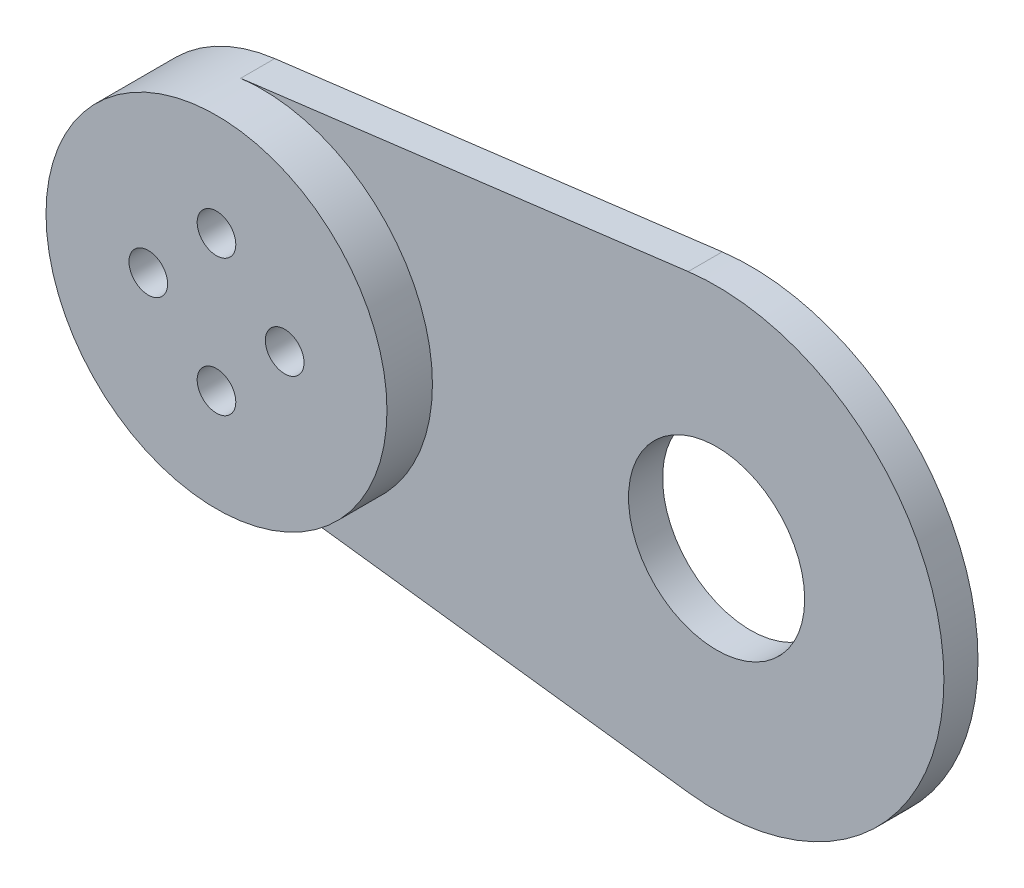
ISO-10303-21;
HEADER;
FILE_DESCRIPTION(('STEP AP214'),'2;1');
FILE_NAME('part.step','',(''),(''),'','','');
FILE_SCHEMA(('AUTOMOTIVE_DESIGN { 1 0 10303 214 1 1 1 1 }'));
ENDSEC;
DATA;
#1=APPLICATION_CONTEXT('core data for automotive mechanical design processes');
#2=APPLICATION_PROTOCOL_DEFINITION('international standard','automotive_design',2000,#1);
#3=PRODUCT_CONTEXT('',#1,'mechanical');
#4=PRODUCT('Part','Part','',(#3));
#5=PRODUCT_RELATED_PRODUCT_CATEGORY('part','',(#4));
#6=PRODUCT_DEFINITION_FORMATION('','',#4);
#7=PRODUCT_DEFINITION_CONTEXT('part definition',#1,'design');
#8=PRODUCT_DEFINITION('design','',#6,#7);
#9=PRODUCT_DEFINITION_SHAPE('','',#8);
#10=(LENGTH_UNIT() NAMED_UNIT(*) SI_UNIT(.MILLI.,.METRE.));
#11=(NAMED_UNIT(*) PLANE_ANGLE_UNIT() SI_UNIT($,.RADIAN.));
#12=(NAMED_UNIT(*) SI_UNIT($,.STERADIAN.) SOLID_ANGLE_UNIT());
#13=UNCERTAINTY_MEASURE_WITH_UNIT(LENGTH_MEASURE(1.E-05),#10,'distance_accuracy_value','');
#14=(GEOMETRIC_REPRESENTATION_CONTEXT(3) GLOBAL_UNCERTAINTY_ASSIGNED_CONTEXT((#13)) GLOBAL_UNIT_ASSIGNED_CONTEXT((#10,
#11,#12)) REPRESENTATION_CONTEXT('',''));
#15=CARTESIAN_POINT('',(0.,0.,0.));
#16=DIRECTION('',(0.,0.,1.));
#17=DIRECTION('',(1.,0.,0.));
#18=AXIS2_PLACEMENT_3D('',#15,#16,#17);
#19=CARTESIAN_POINT('',(-40.3104524024601,20.9571680563574,0.));
#20=DIRECTION('',(0.,0.,1.));
#21=DIRECTION('',(1.,0.,0.));
#22=AXIS2_PLACEMENT_3D('',#19,#20,#21);
#23=CYLINDRICAL_SURFACE('',#22,20.);
#24=CARTESIAN_POINT('',(-40.3104524024601,20.9571680563574,3.));
#25=DIRECTION('',(0.,0.,1.));
#26=DIRECTION('',(1.,0.,0.));
#27=AXIS2_PLACEMENT_3D('',#24,#25,#26);
#28=CIRCLE('',#27,20.);
#29=CARTESIAN_POINT('',(-42.8104524024601,1.11403322337304,3.));
#30=VERTEX_POINT('',#29);
#31=CARTESIAN_POINT('',(-42.8104524024601,40.8003028893419,3.));
#32=VERTEX_POINT('',#31);
#33=EDGE_CURVE('E85',#30,#32,#28,.T.);
#34=ORIENTED_EDGE('',*,*,#33,.F.);
#35=DIRECTION('',(0.,0.,1.));
#36=VECTOR('',#35,1.);
#37=CARTESIAN_POINT('',(-42.8104524024601,1.11403322337304,0.));
#38=LINE('',#37,#36);
#39=CARTESIAN_POINT('',(-42.8104524024601,1.11403322337304,0.));
#40=VERTEX_POINT('',#39);
#41=EDGE_CURVE('E44',#40,#30,#38,.T.);
#42=ORIENTED_EDGE('',*,*,#41,.F.);
#43=CARTESIAN_POINT('',(-40.3104524024601,20.9571680563574,0.));
#44=DIRECTION('',(0.,0.,1.));
#45=DIRECTION('',(1.,0.,0.));
#46=AXIS2_PLACEMENT_3D('',#43,#44,#45);
#47=CIRCLE('',#46,20.);
#48=CARTESIAN_POINT('',(-42.8104524024601,40.8003028893419,0.));
#49=VERTEX_POINT('',#48);
#50=EDGE_CURVE('E101',#40,#49,#47,.T.);
#51=ORIENTED_EDGE('',*,*,#50,.T.);
#52=DIRECTION('',(0.,0.,1.));
#53=VECTOR('',#52,1.);
#54=CARTESIAN_POINT('',(-42.8104524024601,40.8003028893419,0.));
#55=LINE('',#54,#53);
#56=EDGE_CURVE('E38',#49,#32,#55,.T.);
#57=ORIENTED_EDGE('',*,*,#56,.T.);
#58=EDGE_LOOP('',(#34,#42,#51,#57));
#59=FACE_BOUND('',#58,.T.);
#60=ADVANCED_FACE('F35',(#59),#23,.T.);
#61=CARTESIAN_POINT('',(-82.1854524024601,6.07481693161914,0.));
#62=DIRECTION('',(-0.125,-0.992156741649221,0.));
#63=DIRECTION('',(0.992156741649222,-0.125,0.));
#64=AXIS2_PLACEMENT_3D('',#61,#62,#63);
#65=PLANE('',#64);
#66=DIRECTION('',(0.992156741649221,-0.125,0.));
#67=VECTOR('',#66,1.);
#68=CARTESIAN_POINT('',(-82.1854524024601,6.07481693161914,3.));
#69=LINE('',#68,#67);
#70=CARTESIAN_POINT('',(-82.1854524024601,6.07481693161913,3.));
#71=VERTEX_POINT('',#70);
#72=EDGE_CURVE('E86',#71,#30,#69,.T.);
#73=ORIENTED_EDGE('',*,*,#72,.F.);
#74=DIRECTION('',(0.,0.,1.));
#75=VECTOR('',#74,1.);
#76=CARTESIAN_POINT('',(-82.1854524024601,6.07481693161913,0.));
#77=LINE('',#76,#75);
#78=CARTESIAN_POINT('',(-82.1854524024601,6.07481693161913,0.));
#79=VERTEX_POINT('',#78);
#80=EDGE_CURVE('E94',#79,#71,#77,.T.);
#81=ORIENTED_EDGE('',*,*,#80,.F.);
#82=DIRECTION('',(0.992156741649221,-0.125,0.));
#83=VECTOR('',#82,1.);
#84=CARTESIAN_POINT('',(-82.1854524024601,6.07481693161914,0.));
#85=LINE('',#84,#83);
#86=EDGE_CURVE('E108',#79,#40,#85,.T.);
#87=ORIENTED_EDGE('',*,*,#86,.T.);
#88=ORIENTED_EDGE('',*,*,#41,.T.);
#89=EDGE_LOOP('',(#73,#81,#87,#88));
#90=FACE_BOUND('',#89,.T.);
#91=ADVANCED_FACE('F100',(#90),#65,.T.);
#92=CARTESIAN_POINT('',(-80.3104524024601,20.9571680563574,0.));
#93=DIRECTION('',(0.,0.,1.));
#94=DIRECTION('',(1.,0.,0.));
#95=AXIS2_PLACEMENT_3D('',#92,#93,#94);
#96=CYLINDRICAL_SURFACE('',#95,15.);
#97=ORIENTED_EDGE('',*,*,#80,.T.);
#98=CARTESIAN_POINT('',(-80.3104524024601,20.9571680563574,3.));
#99=DIRECTION('',(0.,0.,1.));
#100=DIRECTION('',(1.,0.,0.));
#101=AXIS2_PLACEMENT_3D('',#98,#99,#100);
#102=CIRCLE('',#101,15.);
#103=CARTESIAN_POINT('',(-82.1854524024601,35.8395191810958,3.));
#104=VERTEX_POINT('',#103);
#105=EDGE_CURVE('E11',#71,#104,#102,.T.);
#106=ORIENTED_EDGE('',*,*,#105,.T.);
#107=DIRECTION('',(0.,0.,1.));
#108=VECTOR('',#107,1.);
#109=CARTESIAN_POINT('',(-82.1854524024601,35.8395191810958,0.));
#110=LINE('',#109,#108);
#111=CARTESIAN_POINT('',(-82.1854524024601,35.8395191810958,0.));
#112=VERTEX_POINT('',#111);
#113=EDGE_CURVE('E88',#112,#104,#110,.T.);
#114=ORIENTED_EDGE('',*,*,#113,.F.);
#115=CARTESIAN_POINT('',(-80.3104524024601,20.9571680563574,0.));
#116=DIRECTION('',(0.,0.,1.));
#117=DIRECTION('',(1.,0.,0.));
#118=AXIS2_PLACEMENT_3D('',#115,#116,#117);
#119=CIRCLE('',#118,15.);
#120=EDGE_CURVE('E97',#112,#79,#119,.T.);
#121=ORIENTED_EDGE('',*,*,#120,.T.);
#122=EDGE_LOOP('',(#97,#106,#114,#121));
#123=FACE_BOUND('',#122,.T.);
#124=CARTESIAN_POINT('',(-80.3104524024601,20.9571680563574,7.));
#125=DIRECTION('',(0.,0.,1.));
#126=DIRECTION('',(1.,0.,0.));
#127=AXIS2_PLACEMENT_3D('',#124,#125,#126);
#128=CIRCLE('',#127,15.);
#129=CARTESIAN_POINT('',(-65.3104524024601,20.9571680563574,7.));
#130=VERTEX_POINT('',#129);
#131=EDGE_CURVE('E115',#130,#130,#128,.T.);
#132=ORIENTED_EDGE('',*,*,#131,.F.);
#133=EDGE_LOOP('',(#132));
#134=FACE_BOUND('',#133,.T.);
#135=ADVANCED_FACE('F95',(#123,#134),#96,.T.);
#136=CARTESIAN_POINT('',(-42.8104524024601,40.8003028893419,0.));
#137=DIRECTION('',(-0.124999999999999,0.992156741649222,0.));
#138=DIRECTION('',(-0.992156741649222,-0.124999999999999,0.));
#139=AXIS2_PLACEMENT_3D('',#136,#137,#138);
#140=PLANE('',#139);
#141=DIRECTION('',(-0.992156741649221,-0.124999999999999,0.));
#142=VECTOR('',#141,1.);
#143=CARTESIAN_POINT('',(-42.8104524024601,40.8003028893419,3.));
#144=LINE('',#143,#142);
#145=EDGE_CURVE('E81',#32,#104,#144,.T.);
#146=ORIENTED_EDGE('',*,*,#145,.F.);
#147=ORIENTED_EDGE('',*,*,#56,.F.);
#148=DIRECTION('',(-0.992156741649221,-0.124999999999999,0.));
#149=VECTOR('',#148,1.);
#150=CARTESIAN_POINT('',(-42.8104524024601,40.8003028893419,0.));
#151=LINE('',#150,#149);
#152=EDGE_CURVE('E90',#49,#112,#151,.T.);
#153=ORIENTED_EDGE('',*,*,#152,.T.);
#154=ORIENTED_EDGE('',*,*,#113,.T.);
#155=EDGE_LOOP('',(#146,#147,#153,#154));
#156=FACE_BOUND('',#155,.T.);
#157=ADVANCED_FACE('F89',(#156),#140,.T.);
#158=CARTESIAN_POINT('',(-40.3104524024601,20.9571680563574,0.));
#159=DIRECTION('',(0.,0.,1.));
#160=DIRECTION('',(1.,0.,0.));
#161=AXIS2_PLACEMENT_3D('',#158,#159,#160);
#162=PLANE('',#161);
#163=CARTESIAN_POINT('',(-74.3104524024601,20.9571680563574,0.));
#164=DIRECTION('',(0.,0.,1.));
#165=DIRECTION('',(1.,0.,0.));
#166=AXIS2_PLACEMENT_3D('',#163,#164,#165);
#167=CIRCLE('',#166,1.69999999999999);
#168=CARTESIAN_POINT('',(-72.6104524024601,20.9571680563574,0.));
#169=VERTEX_POINT('',#168);
#170=EDGE_CURVE('E137',#169,#169,#167,.T.);
#171=ORIENTED_EDGE('',*,*,#170,.T.);
#172=EDGE_LOOP('',(#171));
#173=FACE_BOUND('',#172,.T.);
#174=CARTESIAN_POINT('',(-80.3104524024602,14.9571680563574,0.));
#175=DIRECTION('',(0.,0.,1.));
#176=DIRECTION('',(1.,0.,0.));
#177=AXIS2_PLACEMENT_3D('',#174,#175,#176);
#178=CIRCLE('',#177,1.69999999999999);
#179=CARTESIAN_POINT('',(-78.6104524024602,14.9571680563574,0.));
#180=VERTEX_POINT('',#179);
#181=EDGE_CURVE('E130',#180,#180,#178,.T.);
#182=ORIENTED_EDGE('',*,*,#181,.T.);
#183=EDGE_LOOP('',(#182));
#184=FACE_BOUND('',#183,.T.);
#185=CARTESIAN_POINT('',(-86.3104524024601,20.9571680563574,0.));
#186=DIRECTION('',(0.,0.,1.));
#187=DIRECTION('',(1.,0.,0.));
#188=AXIS2_PLACEMENT_3D('',#185,#186,#187);
#189=CIRCLE('',#188,1.7);
#190=CARTESIAN_POINT('',(-84.6104524024601,20.9571680563574,0.));
#191=VERTEX_POINT('',#190);
#192=EDGE_CURVE('E131',#191,#191,#189,.T.);
#193=ORIENTED_EDGE('',*,*,#192,.T.);
#194=EDGE_LOOP('',(#193));
#195=FACE_BOUND('',#194,.T.);
#196=CARTESIAN_POINT('',(-80.3104524024601,26.9571680563575,0.));
#197=DIRECTION('',(0.,0.,1.));
#198=DIRECTION('',(1.,0.,0.));
#199=AXIS2_PLACEMENT_3D('',#196,#197,#198);
#200=CIRCLE('',#199,1.7);
#201=CARTESIAN_POINT('',(-78.6104524024601,26.9571680563575,0.));
#202=VERTEX_POINT('',#201);
#203=EDGE_CURVE('E120',#202,#202,#200,.T.);
#204=ORIENTED_EDGE('',*,*,#203,.T.);
#205=EDGE_LOOP('',(#204));
#206=FACE_BOUND('',#205,.T.);
#207=CARTESIAN_POINT('',(-40.3104524024601,20.9571680563574,0.));
#208=DIRECTION('',(0.,0.,1.));
#209=DIRECTION('',(1.,0.,0.));
#210=AXIS2_PLACEMENT_3D('',#207,#208,#209);
#211=CIRCLE('',#210,7.75);
#212=CARTESIAN_POINT('',(-32.5604524024601,20.9571680563574,0.));
#213=VERTEX_POINT('',#212);
#214=EDGE_CURVE('E107',#213,#213,#211,.T.);
#215=ORIENTED_EDGE('',*,*,#214,.T.);
#216=EDGE_LOOP('',(#215));
#217=FACE_BOUND('',#216,.T.);
#218=ORIENTED_EDGE('',*,*,#50,.F.);
#219=ORIENTED_EDGE('',*,*,#86,.F.);
#220=ORIENTED_EDGE('',*,*,#120,.F.);
#221=ORIENTED_EDGE('',*,*,#152,.F.);
#222=EDGE_LOOP('',(#218,#219,#220,#221));
#223=FACE_BOUND('',#222,.T.);
#224=ADVANCED_FACE('F145',(#173,#184,#195,#206,#217,#223),#162,.F.);
#225=CARTESIAN_POINT('',(-40.3104524024601,20.9571680563574,3.));
#226=DIRECTION('',(0.,0.,1.));
#227=DIRECTION('',(1.,0.,0.));
#228=AXIS2_PLACEMENT_3D('',#225,#226,#227);
#229=PLANE('',#228);
#230=ORIENTED_EDGE('',*,*,#105,.F.);
#231=ORIENTED_EDGE('',*,*,#72,.T.);
#232=ORIENTED_EDGE('',*,*,#33,.T.);
#233=ORIENTED_EDGE('',*,*,#145,.T.);
#234=EDGE_LOOP('',(#230,#231,#232,#233));
#235=FACE_BOUND('',#234,.T.);
#236=CARTESIAN_POINT('',(-40.3104524024601,20.9571680563574,3.));
#237=DIRECTION('',(0.,0.,1.));
#238=DIRECTION('',(1.,0.,0.));
#239=AXIS2_PLACEMENT_3D('',#236,#237,#238);
#240=CIRCLE('',#239,7.75);
#241=CARTESIAN_POINT('',(-32.5604524024601,20.9571680563574,3.));
#242=VERTEX_POINT('',#241);
#243=EDGE_CURVE('E112',#242,#242,#240,.T.);
#244=ORIENTED_EDGE('',*,*,#243,.F.);
#245=EDGE_LOOP('',(#244));
#246=FACE_BOUND('',#245,.T.);
#247=ADVANCED_FACE('F83',(#235,#246),#229,.T.);
#248=CARTESIAN_POINT('',(-40.3104524024601,20.9571680563574,0.));
#249=DIRECTION('',(0.,0.,1.));
#250=DIRECTION('',(1.,0.,0.));
#251=AXIS2_PLACEMENT_3D('',#248,#249,#250);
#252=CYLINDRICAL_SURFACE('',#251,7.75);
#253=ORIENTED_EDGE('',*,*,#214,.F.);
#254=EDGE_LOOP('',(#253));
#255=FACE_BOUND('',#254,.T.);
#256=ORIENTED_EDGE('',*,*,#243,.T.);
#257=EDGE_LOOP('',(#256));
#258=FACE_BOUND('',#257,.T.);
#259=ADVANCED_FACE('F159',(#255,#258),#252,.F.);
#260=CARTESIAN_POINT('',(0.,0.,7.));
#261=DIRECTION('',(0.,0.,1.));
#262=DIRECTION('',(1.,0.,0.));
#263=AXIS2_PLACEMENT_3D('',#260,#261,#262);
#264=PLANE('',#263);
#265=CARTESIAN_POINT('',(-74.3104524024601,20.9571680563574,7.));
#266=DIRECTION('',(0.,0.,1.));
#267=DIRECTION('',(1.,0.,0.));
#268=AXIS2_PLACEMENT_3D('',#265,#266,#267);
#269=CIRCLE('',#268,1.69999999999999);
#270=CARTESIAN_POINT('',(-72.6104524024601,20.9571680563574,7.));
#271=VERTEX_POINT('',#270);
#272=EDGE_CURVE('E126',#271,#271,#269,.T.);
#273=ORIENTED_EDGE('',*,*,#272,.F.);
#274=EDGE_LOOP('',(#273));
#275=FACE_BOUND('',#274,.T.);
#276=CARTESIAN_POINT('',(-80.3104524024602,14.9571680563574,7.));
#277=DIRECTION('',(0.,0.,1.));
#278=DIRECTION('',(1.,0.,0.));
#279=AXIS2_PLACEMENT_3D('',#276,#277,#278);
#280=CIRCLE('',#279,1.69999999999999);
#281=CARTESIAN_POINT('',(-78.6104524024602,14.9571680563574,7.));
#282=VERTEX_POINT('',#281);
#283=EDGE_CURVE('E134',#282,#282,#280,.T.);
#284=ORIENTED_EDGE('',*,*,#283,.F.);
#285=EDGE_LOOP('',(#284));
#286=FACE_BOUND('',#285,.T.);
#287=CARTESIAN_POINT('',(-86.3104524024601,20.9571680563574,7.));
#288=DIRECTION('',(0.,0.,1.));
#289=DIRECTION('',(1.,0.,0.));
#290=AXIS2_PLACEMENT_3D('',#287,#288,#289);
#291=CIRCLE('',#290,1.7);
#292=CARTESIAN_POINT('',(-84.6104524024601,20.9571680563574,7.));
#293=VERTEX_POINT('',#292);
#294=EDGE_CURVE('E127',#293,#293,#291,.T.);
#295=ORIENTED_EDGE('',*,*,#294,.F.);
#296=EDGE_LOOP('',(#295));
#297=FACE_BOUND('',#296,.T.);
#298=CARTESIAN_POINT('',(-80.3104524024601,26.9571680563575,7.));
#299=DIRECTION('',(0.,0.,1.));
#300=DIRECTION('',(1.,0.,0.));
#301=AXIS2_PLACEMENT_3D('',#298,#299,#300);
#302=CIRCLE('',#301,1.7);
#303=CARTESIAN_POINT('',(-78.6104524024601,26.9571680563575,7.));
#304=VERTEX_POINT('',#303);
#305=EDGE_CURVE('E123',#304,#304,#302,.T.);
#306=ORIENTED_EDGE('',*,*,#305,.F.);
#307=EDGE_LOOP('',(#306));
#308=FACE_BOUND('',#307,.T.);
#309=ORIENTED_EDGE('',*,*,#131,.T.);
#310=EDGE_LOOP('',(#309));
#311=FACE_BOUND('',#310,.T.);
#312=ADVANCED_FACE('F155',(#275,#286,#297,#308,#311),#264,.T.);
#313=CARTESIAN_POINT('',(-80.3104524024601,26.9571680563575,0.));
#314=DIRECTION('',(0.,0.,1.));
#315=DIRECTION('',(1.,0.,0.));
#316=AXIS2_PLACEMENT_3D('',#313,#314,#315);
#317=CYLINDRICAL_SURFACE('',#316,1.7);
#318=ORIENTED_EDGE('',*,*,#203,.F.);
#319=EDGE_LOOP('',(#318));
#320=FACE_BOUND('',#319,.T.);
#321=ORIENTED_EDGE('',*,*,#305,.T.);
#322=EDGE_LOOP('',(#321));
#323=FACE_BOUND('',#322,.T.);
#324=ADVANCED_FACE('F158',(#320,#323),#317,.F.);
#325=CARTESIAN_POINT('',(-86.3104524024601,20.9571680563574,0.));
#326=DIRECTION('',(0.,0.,1.));
#327=DIRECTION('',(1.,0.,0.));
#328=AXIS2_PLACEMENT_3D('',#325,#326,#327);
#329=CYLINDRICAL_SURFACE('',#328,1.7);
#330=ORIENTED_EDGE('',*,*,#192,.F.);
#331=EDGE_LOOP('',(#330));
#332=FACE_BOUND('',#331,.T.);
#333=ORIENTED_EDGE('',*,*,#294,.T.);
#334=EDGE_LOOP('',(#333));
#335=FACE_BOUND('',#334,.T.);
#336=ADVANCED_FACE('F191',(#332,#335),#329,.F.);
#337=CARTESIAN_POINT('',(-80.3104524024602,14.9571680563574,0.));
#338=DIRECTION('',(0.,0.,1.));
#339=DIRECTION('',(1.,0.,0.));
#340=AXIS2_PLACEMENT_3D('',#337,#338,#339);
#341=CYLINDRICAL_SURFACE('',#340,1.69999999999999);
#342=ORIENTED_EDGE('',*,*,#181,.F.);
#343=EDGE_LOOP('',(#342));
#344=FACE_BOUND('',#343,.T.);
#345=ORIENTED_EDGE('',*,*,#283,.T.);
#346=EDGE_LOOP('',(#345));
#347=FACE_BOUND('',#346,.T.);
#348=ADVANCED_FACE('F151',(#344,#347),#341,.F.);
#349=CARTESIAN_POINT('',(-74.3104524024601,20.9571680563574,0.));
#350=DIRECTION('',(0.,0.,1.));
#351=DIRECTION('',(1.,0.,0.));
#352=AXIS2_PLACEMENT_3D('',#349,#350,#351);
#353=CYLINDRICAL_SURFACE('',#352,1.69999999999999);
#354=ORIENTED_EDGE('',*,*,#170,.F.);
#355=EDGE_LOOP('',(#354));
#356=FACE_BOUND('',#355,.T.);
#357=ORIENTED_EDGE('',*,*,#272,.T.);
#358=EDGE_LOOP('',(#357));
#359=FACE_BOUND('',#358,.T.);
#360=ADVANCED_FACE('F148',(#356,#359),#353,.F.);
#361=CLOSED_SHELL('',(#60,#91,#135,#157,#224,#247,#259,#312,#324,#336,#348,#360));
#362=MANIFOLD_SOLID_BREP('B2',#361);
#363=ADVANCED_BREP_SHAPE_REPRESENTATION('',(#18,#362),#14);
#364=SHAPE_DEFINITION_REPRESENTATION(#9,#363);
ENDSEC;
END-ISO-10303-21;
